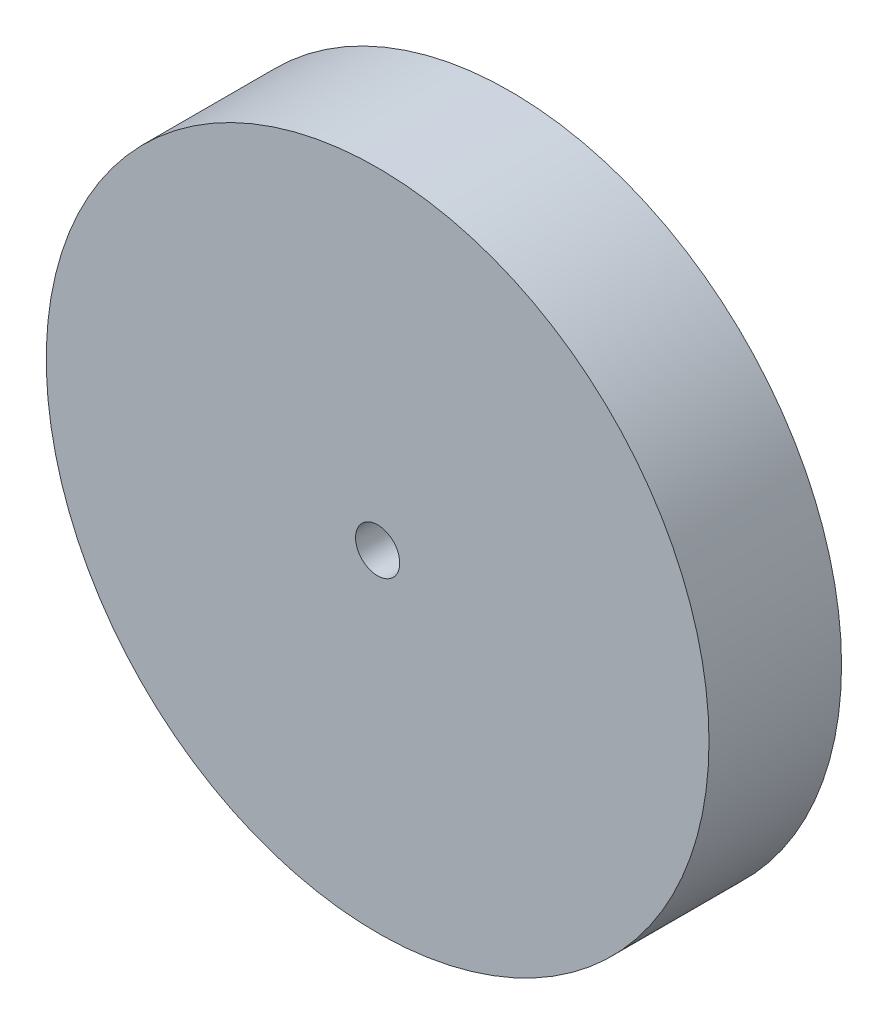
ISO-10303-21;
HEADER;
FILE_DESCRIPTION(('STEP AP214'),'2;1');
FILE_NAME('part.step','',(''),(''),'','','');
FILE_SCHEMA(('AUTOMOTIVE_DESIGN { 1 0 10303 214 1 1 1 1 }'));
ENDSEC;
DATA;
#1=APPLICATION_CONTEXT('core data for automotive mechanical design processes');
#2=APPLICATION_PROTOCOL_DEFINITION('international standard','automotive_design',2000,#1);
#3=PRODUCT_CONTEXT('',#1,'mechanical');
#4=PRODUCT('Part','Part','',(#3));
#5=PRODUCT_RELATED_PRODUCT_CATEGORY('part','',(#4));
#6=PRODUCT_DEFINITION_FORMATION('','',#4);
#7=PRODUCT_DEFINITION_CONTEXT('part definition',#1,'design');
#8=PRODUCT_DEFINITION('design','',#6,#7);
#9=PRODUCT_DEFINITION_SHAPE('','',#8);
#10=(LENGTH_UNIT() NAMED_UNIT(*) SI_UNIT(.MILLI.,.METRE.));
#11=(NAMED_UNIT(*) PLANE_ANGLE_UNIT() SI_UNIT($,.RADIAN.));
#12=(NAMED_UNIT(*) SI_UNIT($,.STERADIAN.) SOLID_ANGLE_UNIT());
#13=UNCERTAINTY_MEASURE_WITH_UNIT(LENGTH_MEASURE(1.E-05),#10,'distance_accuracy_value','');
#14=(GEOMETRIC_REPRESENTATION_CONTEXT(3) GLOBAL_UNCERTAINTY_ASSIGNED_CONTEXT((#13)) GLOBAL_UNIT_ASSIGNED_CONTEXT((#10,
#11,#12)) REPRESENTATION_CONTEXT('',''));
#15=CARTESIAN_POINT('',(0.,0.,0.));
#16=DIRECTION('',(0.,0.,1.));
#17=DIRECTION('',(1.,0.,0.));
#18=AXIS2_PLACEMENT_3D('',#15,#16,#17);
#19=CARTESIAN_POINT('',(0.,0.,30.));
#20=DIRECTION('',(0.,0.,1.));
#21=DIRECTION('',(1.,0.,0.));
#22=AXIS2_PLACEMENT_3D('',#19,#20,#21);
#23=PLANE('',#22);
#24=CARTESIAN_POINT('',(0.,0.,30.));
#25=DIRECTION('',(0.,0.,1.));
#26=DIRECTION('',(1.,0.,0.));
#27=AXIS2_PLACEMENT_3D('',#24,#25,#26);
#28=CIRCLE('',#27,75.);
#29=CARTESIAN_POINT('',(75.,0.,30.));
#30=VERTEX_POINT('',#29);
#31=EDGE_CURVE('E10',#30,#30,#28,.T.);
#32=ORIENTED_EDGE('',*,*,#31,.T.);
#33=EDGE_LOOP('',(#32));
#34=FACE_BOUND('',#33,.T.);
#35=CARTESIAN_POINT('',(0.,0.,30.));
#36=DIRECTION('',(0.,0.,1.));
#37=DIRECTION('',(1.,0.,0.));
#38=AXIS2_PLACEMENT_3D('',#35,#36,#37);
#39=CIRCLE('',#38,5.);
#40=CARTESIAN_POINT('',(5.,0.,30.));
#41=VERTEX_POINT('',#40);
#42=EDGE_CURVE('E40',#41,#41,#39,.T.);
#43=ORIENTED_EDGE('',*,*,#42,.F.);
#44=EDGE_LOOP('',(#43));
#45=FACE_BOUND('',#44,.T.);
#46=ADVANCED_FACE('F29',(#34,#45),#23,.T.);
#47=CARTESIAN_POINT('',(0.,0.,0.));
#48=DIRECTION('',(0.,0.,1.));
#49=DIRECTION('',(1.,0.,0.));
#50=AXIS2_PLACEMENT_3D('',#47,#48,#49);
#51=PLANE('',#50);
#52=CARTESIAN_POINT('',(0.,0.,0.));
#53=DIRECTION('',(0.,0.,1.));
#54=DIRECTION('',(1.,0.,0.));
#55=AXIS2_PLACEMENT_3D('',#52,#53,#54);
#56=CIRCLE('',#55,75.);
#57=CARTESIAN_POINT('',(75.,0.,0.));
#58=VERTEX_POINT('',#57);
#59=EDGE_CURVE('E33',#58,#58,#56,.T.);
#60=ORIENTED_EDGE('',*,*,#59,.F.);
#61=EDGE_LOOP('',(#60));
#62=FACE_BOUND('',#61,.T.);
#63=CARTESIAN_POINT('',(0.,0.,0.));
#64=DIRECTION('',(0.,0.,1.));
#65=DIRECTION('',(1.,0.,0.));
#66=AXIS2_PLACEMENT_3D('',#63,#64,#65);
#67=CIRCLE('',#66,5.);
#68=CARTESIAN_POINT('',(5.,0.,0.));
#69=VERTEX_POINT('',#68);
#70=EDGE_CURVE('E42',#69,#69,#67,.T.);
#71=ORIENTED_EDGE('',*,*,#70,.T.);
#72=EDGE_LOOP('',(#71));
#73=FACE_BOUND('',#72,.T.);
#74=ADVANCED_FACE('F52',(#62,#73),#51,.F.);
#75=CARTESIAN_POINT('',(0.,0.,30.));
#76=DIRECTION('',(0.,0.,-1.));
#77=DIRECTION('',(-1.,0.,0.));
#78=AXIS2_PLACEMENT_3D('',#75,#76,#77);
#79=CYLINDRICAL_SURFACE('',#78,75.);
#80=ORIENTED_EDGE('',*,*,#31,.F.);
#81=EDGE_LOOP('',(#80));
#82=FACE_BOUND('',#81,.T.);
#83=ORIENTED_EDGE('',*,*,#59,.T.);
#84=EDGE_LOOP('',(#83));
#85=FACE_BOUND('',#84,.T.);
#86=ADVANCED_FACE('F31',(#82,#85),#79,.T.);
#87=CARTESIAN_POINT('',(0.,0.,30.));
#88=DIRECTION('',(0.,0.,-1.));
#89=DIRECTION('',(-1.,0.,0.));
#90=AXIS2_PLACEMENT_3D('',#87,#88,#89);
#91=CYLINDRICAL_SURFACE('',#90,5.);
#92=ORIENTED_EDGE('',*,*,#42,.T.);
#93=EDGE_LOOP('',(#92));
#94=FACE_BOUND('',#93,.T.);
#95=ORIENTED_EDGE('',*,*,#70,.F.);
#96=EDGE_LOOP('',(#95));
#97=FACE_BOUND('',#96,.T.);
#98=ADVANCED_FACE('F48',(#94,#97),#91,.F.);
#99=CLOSED_SHELL('',(#46,#74,#86,#98));
#100=MANIFOLD_SOLID_BREP('B2',#99);
#101=ADVANCED_BREP_SHAPE_REPRESENTATION('',(#18,#100),#14);
#102=SHAPE_DEFINITION_REPRESENTATION(#9,#101);
ENDSEC;
END-ISO-10303-21;
